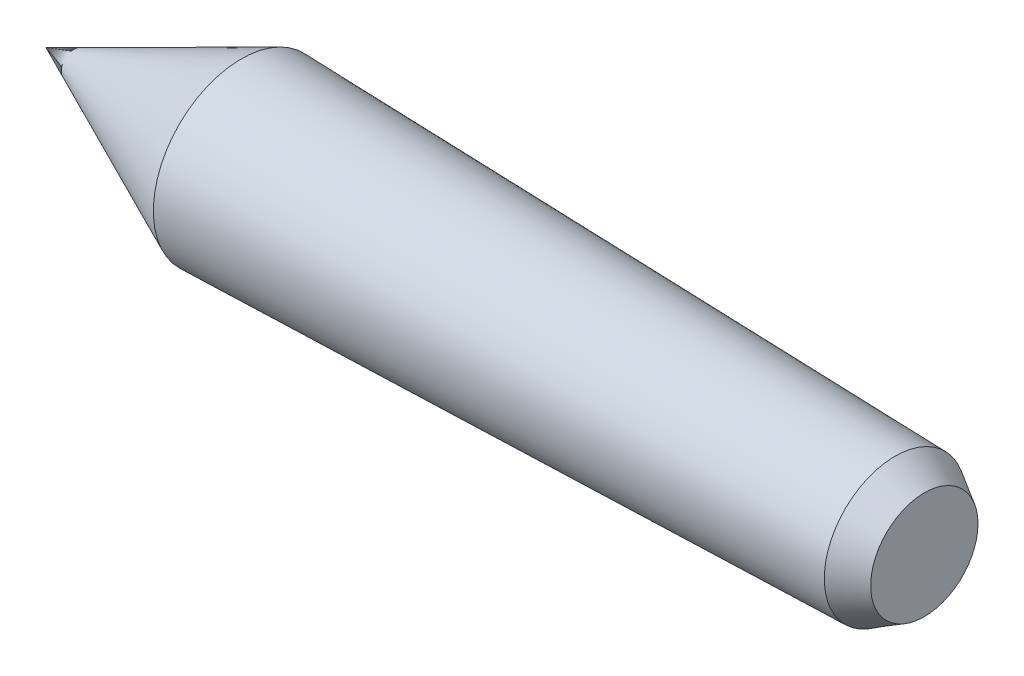
ISO-10303-21;
HEADER;
FILE_DESCRIPTION(('STEP AP214'),'2;1');
FILE_NAME('part.step','',(''),(''),'','','');
FILE_SCHEMA(('AUTOMOTIVE_DESIGN { 1 0 10303 214 1 1 1 1 }'));
ENDSEC;
DATA;
#1=APPLICATION_CONTEXT('core data for automotive mechanical design processes');
#2=APPLICATION_PROTOCOL_DEFINITION('international standard','automotive_design',2000,#1);
#3=PRODUCT_CONTEXT('',#1,'mechanical');
#4=PRODUCT('Part','Part','',(#3));
#5=PRODUCT_RELATED_PRODUCT_CATEGORY('part','',(#4));
#6=PRODUCT_DEFINITION_FORMATION('','',#4);
#7=PRODUCT_DEFINITION_CONTEXT('part definition',#1,'design');
#8=PRODUCT_DEFINITION('design','',#6,#7);
#9=PRODUCT_DEFINITION_SHAPE('','',#8);
#10=(LENGTH_UNIT() NAMED_UNIT(*) SI_UNIT(.MILLI.,.METRE.));
#11=(NAMED_UNIT(*) PLANE_ANGLE_UNIT() SI_UNIT($,.RADIAN.));
#12=(NAMED_UNIT(*) SI_UNIT($,.STERADIAN.) SOLID_ANGLE_UNIT());
#13=UNCERTAINTY_MEASURE_WITH_UNIT(LENGTH_MEASURE(1.E-05),#10,'distance_accuracy_value','');
#14=(GEOMETRIC_REPRESENTATION_CONTEXT(3) GLOBAL_UNCERTAINTY_ASSIGNED_CONTEXT((#13)) GLOBAL_UNIT_ASSIGNED_CONTEXT((#10,
#11,#12)) REPRESENTATION_CONTEXT('',''));
#15=CARTESIAN_POINT('',(0.,0.,0.));
#16=DIRECTION('',(0.,0.,1.));
#17=DIRECTION('',(1.,0.,0.));
#18=AXIS2_PLACEMENT_3D('',#15,#16,#17);
#19=CARTESIAN_POINT('',(90.,5.5,0.));
#20=DIRECTION('',(1.,0.,0.));
#21=DIRECTION('',(0.,0.,-1.));
#22=AXIS2_PLACEMENT_3D('',#19,#20,#21);
#23=PLANE('',#22);
#24=CARTESIAN_POINT('',(90.,0.,0.));
#25=DIRECTION('',(1.,0.,0.));
#26=DIRECTION('',(0.,0.,-1.));
#27=AXIS2_PLACEMENT_3D('',#24,#25,#26);
#28=CIRCLE('',#27,5.5);
#29=CARTESIAN_POINT('',(90.,0.,-5.5));
#30=VERTEX_POINT('',#29);
#31=EDGE_CURVE('E11',#30,#30,#28,.T.);
#32=ORIENTED_EDGE('',*,*,#31,.T.);
#33=EDGE_LOOP('',(#32));
#34=FACE_BOUND('',#33,.T.);
#35=ADVANCED_FACE('F33',(#34),#23,.T.);
#36=CARTESIAN_POINT('',(90.,0.,0.));
#37=DIRECTION('',(-1.,0.,0.));
#38=DIRECTION('',(0.,0.,1.));
#39=AXIS2_PLACEMENT_3D('',#36,#37,#38);
#40=CONICAL_SURFACE('',#39,5.5,0.528074448426359);
#41=CARTESIAN_POINT('',(87.,0.,0.));
#42=DIRECTION('',(1.,0.,0.));
#43=DIRECTION('',(0.,0.,-1.));
#44=AXIS2_PLACEMENT_3D('',#41,#42,#43);
#45=CIRCLE('',#44,7.25);
#46=CARTESIAN_POINT('',(87.,0.,-7.25));
#47=VERTEX_POINT('',#46);
#48=EDGE_CURVE('E39',#47,#47,#45,.T.);
#49=ORIENTED_EDGE('',*,*,#48,.T.);
#50=EDGE_LOOP('',(#49));
#51=FACE_BOUND('',#50,.T.);
#52=ORIENTED_EDGE('',*,*,#31,.F.);
#53=EDGE_LOOP('',(#52));
#54=FACE_BOUND('',#53,.T.);
#55=ADVANCED_FACE('F55',(#51,#54),#40,.T.);
#56=CARTESIAN_POINT('',(87.,0.,0.));
#57=DIRECTION('',(-1.,0.,0.));
#58=DIRECTION('',(0.,0.,1.));
#59=AXIS2_PLACEMENT_3D('',#56,#57,#58);
#60=CONICAL_SURFACE('',#59,7.25,0.0261134656608975);
#61=CARTESIAN_POINT('',(20.,0.,0.));
#62=DIRECTION('',(1.,0.,0.));
#63=DIRECTION('',(0.,0.,-1.));
#64=AXIS2_PLACEMENT_3D('',#61,#62,#63);
#65=CIRCLE('',#64,9.);
#66=CARTESIAN_POINT('',(20.,0.,-9.));
#67=VERTEX_POINT('',#66);
#68=EDGE_CURVE('E49',#67,#67,#65,.T.);
#69=ORIENTED_EDGE('',*,*,#68,.T.);
#70=EDGE_LOOP('',(#69));
#71=FACE_BOUND('',#70,.T.);
#72=ORIENTED_EDGE('',*,*,#48,.F.);
#73=EDGE_LOOP('',(#72));
#74=FACE_BOUND('',#73,.T.);
#75=ADVANCED_FACE('F45',(#71,#74),#60,.T.);
#76=CARTESIAN_POINT('',(20.,0.,0.));
#77=DIRECTION('',(1.,0.,0.));
#78=DIRECTION('',(0.,0.,-1.));
#79=AXIS2_PLACEMENT_3D('',#76,#77,#78);
#80=CONICAL_SURFACE('',#79,9.,0.422853926132941);
#81=CARTESIAN_POINT('',(0.,0.,0.));
#82=VERTEX_POINT('',#81);
#83=VERTEX_LOOP('',#82);
#84=FACE_BOUND('',#83,.T.);
#85=ORIENTED_EDGE('',*,*,#68,.F.);
#86=EDGE_LOOP('',(#85));
#87=FACE_BOUND('',#86,.T.);
#88=ADVANCED_FACE('F42',(#84,#87),#80,.T.);
#89=CLOSED_SHELL('',(#35,#55,#75,#88));
#90=MANIFOLD_SOLID_BREP('B2',#89);
#91=ADVANCED_BREP_SHAPE_REPRESENTATION('',(#18,#90),#14);
#92=SHAPE_DEFINITION_REPRESENTATION(#9,#91);
ENDSEC;
END-ISO-10303-21;
